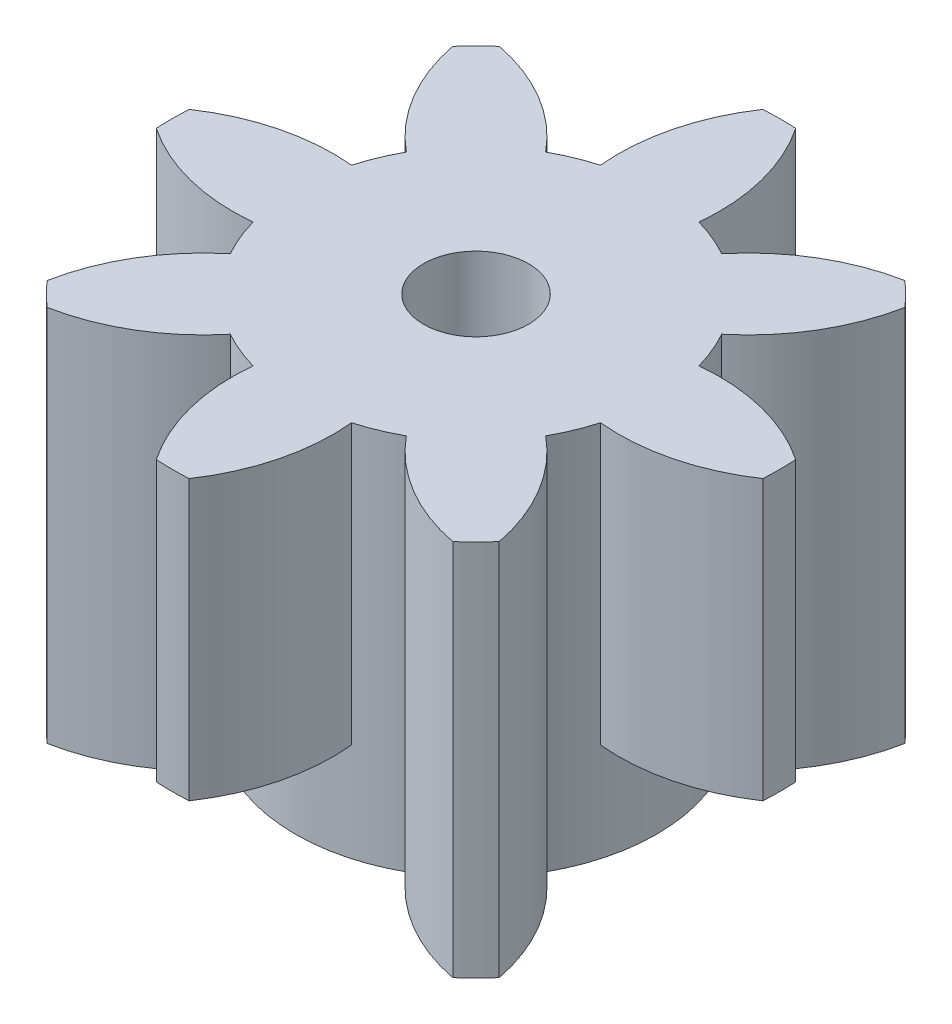
ISO-10303-21;
HEADER;
FILE_DESCRIPTION(('STEP AP214'),'2;1');
FILE_NAME('part.step','',(''),(''),'','','');
FILE_SCHEMA(('AUTOMOTIVE_DESIGN { 1 0 10303 214 1 1 1 1 }'));
ENDSEC;
DATA;
#1=APPLICATION_CONTEXT('core data for automotive mechanical design processes');
#2=APPLICATION_PROTOCOL_DEFINITION('international standard','automotive_design',2000,#1);
#3=PRODUCT_CONTEXT('',#1,'mechanical');
#4=PRODUCT('Part','Part','',(#3));
#5=PRODUCT_RELATED_PRODUCT_CATEGORY('part','',(#4));
#6=PRODUCT_DEFINITION_FORMATION('','',#4);
#7=PRODUCT_DEFINITION_CONTEXT('part definition',#1,'design');
#8=PRODUCT_DEFINITION('design','',#6,#7);
#9=PRODUCT_DEFINITION_SHAPE('','',#8);
#10=(LENGTH_UNIT() NAMED_UNIT(*) SI_UNIT(.MILLI.,.METRE.));
#11=(NAMED_UNIT(*) PLANE_ANGLE_UNIT() SI_UNIT($,.RADIAN.));
#12=(NAMED_UNIT(*) SI_UNIT($,.STERADIAN.) SOLID_ANGLE_UNIT());
#13=UNCERTAINTY_MEASURE_WITH_UNIT(LENGTH_MEASURE(1.E-05),#10,'distance_accuracy_value','');
#14=(GEOMETRIC_REPRESENTATION_CONTEXT(3) GLOBAL_UNCERTAINTY_ASSIGNED_CONTEXT((#13)) GLOBAL_UNIT_ASSIGNED_CONTEXT((#10,
#11,#12)) REPRESENTATION_CONTEXT('',''));
#15=CARTESIAN_POINT('',(0.,0.,0.));
#16=DIRECTION('',(0.,0.,1.));
#17=DIRECTION('',(1.,0.,0.));
#18=AXIS2_PLACEMENT_3D('',#15,#16,#17);
#19=CARTESIAN_POINT('',(-8.94271485970791,-6.,11.754142204529));
#20=DIRECTION('',(0.,1.,0.));
#21=DIRECTION('',(0.,0.,1.));
#22=AXIS2_PLACEMENT_3D('',#19,#20,#21);
#23=CYLINDRICAL_SURFACE('',#22,12.);
#24=DIRECTION('',(0.,1.,0.));
#25=VECTOR('',#24,1.);
#26=CARTESIAN_POINT('',(0.999999999999954,-6.,18.4729532019112));
#27=LINE('',#26,#25);
#28=CARTESIAN_POINT('',(0.999999999999954,0.,18.4729532019112));
#29=VERTEX_POINT('',#28);
#30=CARTESIAN_POINT('',(0.999999999999954,17.,18.4729532019112));
#31=VERTEX_POINT('',#30);
#32=EDGE_CURVE('E49',#29,#31,#27,.T.);
#33=ORIENTED_EDGE('',*,*,#32,.F.);
#34=CARTESIAN_POINT('',(-8.94271485970791,0.,11.754142204529));
#35=DIRECTION('',(0.,1.,0.));
#36=DIRECTION('',(0.,0.,1.));
#37=AXIS2_PLACEMENT_3D('',#34,#35,#36);
#38=CIRCLE('',#37,12.);
#39=CARTESIAN_POINT('',(2.99999999999997,0.,10.5830052442584));
#40=VERTEX_POINT('',#39);
#41=EDGE_CURVE('E445',#29,#40,#38,.T.);
#42=ORIENTED_EDGE('',*,*,#41,.T.);
#43=DIRECTION('',(0.,1.,0.));
#44=VECTOR('',#43,1.);
#45=CARTESIAN_POINT('',(2.99999999999997,-6.,10.5830052442584));
#46=LINE('',#45,#44);
#47=CARTESIAN_POINT('',(2.99999999999997,17.,10.5830052442584));
#48=VERTEX_POINT('',#47);
#49=EDGE_CURVE('E11',#40,#48,#46,.T.);
#50=ORIENTED_EDGE('',*,*,#49,.T.);
#51=CARTESIAN_POINT('',(-8.94271485970791,17.,11.754142204529));
#52=DIRECTION('',(0.,1.,0.));
#53=DIRECTION('',(0.,0.,1.));
#54=AXIS2_PLACEMENT_3D('',#51,#52,#53);
#55=CIRCLE('',#54,12.);
#56=EDGE_CURVE('E526',#31,#48,#55,.T.);
#57=ORIENTED_EDGE('',*,*,#56,.F.);
#58=EDGE_LOOP('',(#33,#42,#50,#57));
#59=FACE_BOUND('',#58,.T.);
#60=ADVANCED_FACE('F41',(#59),#23,.T.);
#61=CARTESIAN_POINT('',(0.,-6.,0.));
#62=DIRECTION('',(0.,1.,0.));
#63=DIRECTION('',(0.,0.,1.));
#64=AXIS2_PLACEMENT_3D('',#61,#62,#63);
#65=CYLINDRICAL_SURFACE('',#64,18.5);
#66=DIRECTION('',(0.,1.,0.));
#67=VECTOR('',#66,1.);
#68=CARTESIAN_POINT('',(-1.00000000000004,-6.,18.4729532019112));
#69=LINE('',#68,#67);
#70=CARTESIAN_POINT('',(-1.00000000000004,0.,18.4729532019112));
#71=VERTEX_POINT('',#70);
#72=CARTESIAN_POINT('',(-1.00000000000004,17.,18.4729532019112));
#73=VERTEX_POINT('',#72);
#74=EDGE_CURVE('E303',#71,#73,#69,.T.);
#75=ORIENTED_EDGE('',*,*,#74,.F.);
#76=CARTESIAN_POINT('',(0.,0.,0.));
#77=DIRECTION('',(0.,1.,0.));
#78=DIRECTION('',(0.,0.,1.));
#79=AXIS2_PLACEMENT_3D('',#76,#77,#78);
#80=CIRCLE('',#79,18.5);
#81=EDGE_CURVE('E444',#71,#29,#80,.T.);
#82=ORIENTED_EDGE('',*,*,#81,.T.);
#83=ORIENTED_EDGE('',*,*,#32,.T.);
#84=CARTESIAN_POINT('',(0.,17.,0.));
#85=DIRECTION('',(0.,1.,0.));
#86=DIRECTION('',(0.,0.,1.));
#87=AXIS2_PLACEMENT_3D('',#84,#85,#86);
#88=CIRCLE('',#87,18.5);
#89=EDGE_CURVE('E424',#73,#31,#88,.T.);
#90=ORIENTED_EDGE('',*,*,#89,.F.);
#91=EDGE_LOOP('',(#75,#82,#83,#90));
#92=FACE_BOUND('',#91,.T.);
#93=ADVANCED_FACE('F573',(#92),#65,.T.);
#94=CARTESIAN_POINT('',(8.94271485970791,-6.,11.754142204529));
#95=DIRECTION('',(0.,1.,0.));
#96=DIRECTION('',(0.,0.,1.));
#97=AXIS2_PLACEMENT_3D('',#94,#95,#96);
#98=CYLINDRICAL_SURFACE('',#97,12.);
#99=CARTESIAN_POINT('',(8.94271485970791,0.,11.754142204529));
#100=DIRECTION('',(0.,1.,0.));
#101=DIRECTION('',(0.,0.,1.));
#102=AXIS2_PLACEMENT_3D('',#99,#100,#101);
#103=CIRCLE('',#102,12.);
#104=CARTESIAN_POINT('',(-3.00000000000004,0.,10.5830052442584));
#105=VERTEX_POINT('',#104);
#106=EDGE_CURVE('E449',#71,#105,#103,.F.);
#107=ORIENTED_EDGE('',*,*,#106,.F.);
#108=ORIENTED_EDGE('',*,*,#74,.T.);
#109=CARTESIAN_POINT('',(8.94271485970791,17.,11.754142204529));
#110=DIRECTION('',(0.,1.,0.));
#111=DIRECTION('',(0.,0.,1.));
#112=AXIS2_PLACEMENT_3D('',#109,#110,#111);
#113=CIRCLE('',#112,12.);
#114=CARTESIAN_POINT('',(-3.00000000000004,17.,10.5830052442584));
#115=VERTEX_POINT('',#114);
#116=EDGE_CURVE('E418',#73,#115,#113,.F.);
#117=ORIENTED_EDGE('',*,*,#116,.T.);
#118=DIRECTION('',(0.,1.,0.));
#119=VECTOR('',#118,1.);
#120=CARTESIAN_POINT('',(-3.00000000000004,-6.,10.5830052442584));
#121=LINE('',#120,#119);
#122=EDGE_CURVE('E304',#105,#115,#121,.T.);
#123=ORIENTED_EDGE('',*,*,#122,.F.);
#124=EDGE_LOOP('',(#107,#108,#117,#123));
#125=FACE_BOUND('',#124,.T.);
#126=ADVANCED_FACE('F577',(#125),#98,.T.);
#127=CARTESIAN_POINT('',(-11.754142204529,-6.,-8.94271485970791));
#128=DIRECTION('',(0.,1.,0.));
#129=DIRECTION('',(0.,0.,1.));
#130=AXIS2_PLACEMENT_3D('',#127,#128,#129);
#131=CYLINDRICAL_SURFACE('',#130,11.9999999999999);
#132=DIRECTION('',(0.,1.,0.));
#133=VECTOR('',#132,1.);
#134=CARTESIAN_POINT('',(-18.4729532019112,-6.,0.999999999999931));
#135=LINE('',#134,#133);
#136=CARTESIAN_POINT('',(-18.4729532019112,0.,0.999999999999931));
#137=VERTEX_POINT('',#136);
#138=CARTESIAN_POINT('',(-18.4729532019112,17.,0.999999999999931));
#139=VERTEX_POINT('',#138);
#140=EDGE_CURVE('E317',#137,#139,#135,.T.);
#141=ORIENTED_EDGE('',*,*,#140,.F.);
#142=CARTESIAN_POINT('',(-11.754142204529,0.,-8.94271485970791));
#143=DIRECTION('',(0.,1.,0.));
#144=DIRECTION('',(0.,0.,1.));
#145=AXIS2_PLACEMENT_3D('',#142,#143,#144);
#146=CIRCLE('',#145,11.9999999999999);
#147=CARTESIAN_POINT('',(-10.5830052442584,0.,2.99999999999995));
#148=VERTEX_POINT('',#147);
#149=EDGE_CURVE('E455',#137,#148,#146,.T.);
#150=ORIENTED_EDGE('',*,*,#149,.T.);
#151=DIRECTION('',(0.,1.,0.));
#152=VECTOR('',#151,1.);
#153=CARTESIAN_POINT('',(-10.5830052442584,-6.,2.99999999999995));
#154=LINE('',#153,#152);
#155=CARTESIAN_POINT('',(-10.5830052442584,17.,2.99999999999995));
#156=VERTEX_POINT('',#155);
#157=EDGE_CURVE('E313',#148,#156,#154,.T.);
#158=ORIENTED_EDGE('',*,*,#157,.T.);
#159=CARTESIAN_POINT('',(-11.754142204529,17.,-8.94271485970791));
#160=DIRECTION('',(0.,1.,0.));
#161=DIRECTION('',(0.,0.,1.));
#162=AXIS2_PLACEMENT_3D('',#159,#160,#161);
#163=CIRCLE('',#162,11.9999999999999);
#164=EDGE_CURVE('E410',#139,#156,#163,.T.);
#165=ORIENTED_EDGE('',*,*,#164,.F.);
#166=EDGE_LOOP('',(#141,#150,#158,#165));
#167=FACE_BOUND('',#166,.T.);
#168=ADVANCED_FACE('F590',(#167),#131,.T.);
#169=CARTESIAN_POINT('',(0.,-6.,0.));
#170=DIRECTION('',(0.,1.,0.));
#171=DIRECTION('',(0.,0.,1.));
#172=AXIS2_PLACEMENT_3D('',#169,#170,#171);
#173=CYLINDRICAL_SURFACE('',#172,18.5);
#174=DIRECTION('',(0.,1.,0.));
#175=VECTOR('',#174,1.);
#176=CARTESIAN_POINT('',(-18.4729532019112,-6.,-1.00000000000007));
#177=LINE('',#176,#175);
#178=CARTESIAN_POINT('',(-18.4729532019112,0.,-1.00000000000007));
#179=VERTEX_POINT('',#178);
#180=CARTESIAN_POINT('',(-18.4729532019112,17.,-1.00000000000007));
#181=VERTEX_POINT('',#180);
#182=EDGE_CURVE('E319',#179,#181,#177,.T.);
#183=ORIENTED_EDGE('',*,*,#182,.F.);
#184=CARTESIAN_POINT('',(0.,0.,0.));
#185=DIRECTION('',(0.,1.,0.));
#186=DIRECTION('',(0.,0.,1.));
#187=AXIS2_PLACEMENT_3D('',#184,#185,#186);
#188=CIRCLE('',#187,18.5);
#189=EDGE_CURVE('E456',#179,#137,#188,.T.);
#190=ORIENTED_EDGE('',*,*,#189,.T.);
#191=ORIENTED_EDGE('',*,*,#140,.T.);
#192=CARTESIAN_POINT('',(0.,17.,0.));
#193=DIRECTION('',(0.,1.,0.));
#194=DIRECTION('',(0.,0.,1.));
#195=AXIS2_PLACEMENT_3D('',#192,#193,#194);
#196=CIRCLE('',#195,18.5);
#197=EDGE_CURVE('E404',#181,#139,#196,.T.);
#198=ORIENTED_EDGE('',*,*,#197,.F.);
#199=EDGE_LOOP('',(#183,#190,#191,#198));
#200=FACE_BOUND('',#199,.T.);
#201=ADVANCED_FACE('F595',(#200),#173,.T.);
#202=CARTESIAN_POINT('',(-11.754142204529,-6.,8.94271485970791));
#203=DIRECTION('',(0.,1.,0.));
#204=DIRECTION('',(0.,0.,1.));
#205=AXIS2_PLACEMENT_3D('',#202,#203,#204);
#206=CYLINDRICAL_SURFACE('',#205,12.0000000000001);
#207=CARTESIAN_POINT('',(-11.754142204529,0.,8.94271485970791));
#208=DIRECTION('',(0.,1.,0.));
#209=DIRECTION('',(0.,0.,1.));
#210=AXIS2_PLACEMENT_3D('',#207,#208,#209);
#211=CIRCLE('',#210,12.0000000000001);
#212=CARTESIAN_POINT('',(-10.5830052442583,0.,-3.00000000000006));
#213=VERTEX_POINT('',#212);
#214=EDGE_CURVE('E441',#179,#213,#211,.F.);
#215=ORIENTED_EDGE('',*,*,#214,.F.);
#216=ORIENTED_EDGE('',*,*,#182,.T.);
#217=CARTESIAN_POINT('',(-11.754142204529,17.,8.94271485970791));
#218=DIRECTION('',(0.,1.,0.));
#219=DIRECTION('',(0.,0.,1.));
#220=AXIS2_PLACEMENT_3D('',#217,#218,#219);
#221=CIRCLE('',#220,12.0000000000001);
#222=CARTESIAN_POINT('',(-10.5830052442583,17.,-3.00000000000006));
#223=VERTEX_POINT('',#222);
#224=EDGE_CURVE('E400',#181,#223,#221,.F.);
#225=ORIENTED_EDGE('',*,*,#224,.T.);
#226=DIRECTION('',(0.,1.,0.));
#227=VECTOR('',#226,1.);
#228=CARTESIAN_POINT('',(-10.5830052442583,-6.,-3.00000000000006));
#229=LINE('',#228,#227);
#230=EDGE_CURVE('E318',#213,#223,#229,.T.);
#231=ORIENTED_EDGE('',*,*,#230,.F.);
#232=EDGE_LOOP('',(#215,#216,#225,#231));
#233=FACE_BOUND('',#232,.T.);
#234=ADVANCED_FACE('F596',(#233),#206,.T.);
#235=CARTESIAN_POINT('',(8.94271485970791,-6.,-11.754142204529));
#236=DIRECTION('',(0.,1.,0.));
#237=DIRECTION('',(0.,0.,1.));
#238=AXIS2_PLACEMENT_3D('',#235,#236,#237);
#239=CYLINDRICAL_SURFACE('',#238,12.);
#240=DIRECTION('',(0.,1.,0.));
#241=VECTOR('',#240,1.);
#242=CARTESIAN_POINT('',(-0.999999999999997,-6.,-18.4729532019112));
#243=LINE('',#242,#241);
#244=CARTESIAN_POINT('',(-0.999999999999997,0.,-18.4729532019112));
#245=VERTEX_POINT('',#244);
#246=CARTESIAN_POINT('',(-0.999999999999997,17.,-18.4729532019112));
#247=VERTEX_POINT('',#246);
#248=EDGE_CURVE('E335',#245,#247,#243,.T.);
#249=ORIENTED_EDGE('',*,*,#248,.F.);
#250=CARTESIAN_POINT('',(8.94271485970791,0.,-11.754142204529));
#251=DIRECTION('',(0.,1.,0.));
#252=DIRECTION('',(0.,0.,1.));
#253=AXIS2_PLACEMENT_3D('',#250,#251,#252);
#254=CIRCLE('',#253,12.);
#255=CARTESIAN_POINT('',(-3.,0.,-10.5830052442584));
#256=VERTEX_POINT('',#255);
#257=EDGE_CURVE('E464',#245,#256,#254,.T.);
#258=ORIENTED_EDGE('',*,*,#257,.T.);
#259=DIRECTION('',(0.,1.,0.));
#260=VECTOR('',#259,1.);
#261=CARTESIAN_POINT('',(-3.,-6.,-10.5830052442584));
#262=LINE('',#261,#260);
#263=CARTESIAN_POINT('',(-3.,17.,-10.5830052442584));
#264=VERTEX_POINT('',#263);
#265=EDGE_CURVE('E327',#256,#264,#262,.T.);
#266=ORIENTED_EDGE('',*,*,#265,.T.);
#267=CARTESIAN_POINT('',(8.94271485970791,17.,-11.754142204529));
#268=DIRECTION('',(0.,1.,0.));
#269=DIRECTION('',(0.,0.,1.));
#270=AXIS2_PLACEMENT_3D('',#267,#268,#269);
#271=CIRCLE('',#270,12.);
#272=EDGE_CURVE('E389',#247,#264,#271,.T.);
#273=ORIENTED_EDGE('',*,*,#272,.F.);
#274=EDGE_LOOP('',(#249,#258,#266,#273));
#275=FACE_BOUND('',#274,.T.);
#276=ADVANCED_FACE('F477',(#275),#239,.T.);
#277=CARTESIAN_POINT('',(0.,-6.,0.));
#278=DIRECTION('',(0.,1.,0.));
#279=DIRECTION('',(0.,0.,1.));
#280=AXIS2_PLACEMENT_3D('',#277,#278,#279);
#281=CYLINDRICAL_SURFACE('',#280,18.5);
#282=DIRECTION('',(0.,1.,0.));
#283=VECTOR('',#282,1.);
#284=CARTESIAN_POINT('',(0.999999999999997,-6.,-18.4729532019112));
#285=LINE('',#284,#283);
#286=CARTESIAN_POINT('',(0.999999999999997,0.,-18.4729532019112));
#287=VERTEX_POINT('',#286);
#288=CARTESIAN_POINT('',(0.999999999999997,17.,-18.4729532019112));
#289=VERTEX_POINT('',#288);
#290=EDGE_CURVE('E333',#287,#289,#285,.T.);
#291=ORIENTED_EDGE('',*,*,#290,.F.);
#292=CARTESIAN_POINT('',(0.,0.,0.));
#293=DIRECTION('',(0.,1.,0.));
#294=DIRECTION('',(0.,0.,1.));
#295=AXIS2_PLACEMENT_3D('',#292,#293,#294);
#296=CIRCLE('',#295,18.5);
#297=EDGE_CURVE('E452',#287,#245,#296,.T.);
#298=ORIENTED_EDGE('',*,*,#297,.T.);
#299=ORIENTED_EDGE('',*,*,#248,.T.);
#300=CARTESIAN_POINT('',(0.,17.,0.));
#301=DIRECTION('',(0.,1.,0.));
#302=DIRECTION('',(0.,0.,1.));
#303=AXIS2_PLACEMENT_3D('',#300,#301,#302);
#304=CIRCLE('',#303,18.5);
#305=EDGE_CURVE('E385',#289,#247,#304,.T.);
#306=ORIENTED_EDGE('',*,*,#305,.F.);
#307=EDGE_LOOP('',(#291,#298,#299,#306));
#308=FACE_BOUND('',#307,.T.);
#309=ADVANCED_FACE('F472',(#308),#281,.T.);
#310=CARTESIAN_POINT('',(-8.94271485970791,-6.,-11.754142204529));
#311=DIRECTION('',(0.,1.,0.));
#312=DIRECTION('',(0.,0.,1.));
#313=AXIS2_PLACEMENT_3D('',#310,#311,#312);
#314=CYLINDRICAL_SURFACE('',#313,12.);
#315=CARTESIAN_POINT('',(-8.94271485970791,0.,-11.754142204529));
#316=DIRECTION('',(0.,1.,0.));
#317=DIRECTION('',(0.,0.,1.));
#318=AXIS2_PLACEMENT_3D('',#315,#316,#317);
#319=CIRCLE('',#318,12.);
#320=CARTESIAN_POINT('',(3.,0.,-10.5830052442584));
#321=VERTEX_POINT('',#320);
#322=EDGE_CURVE('E268',#287,#321,#319,.F.);
#323=ORIENTED_EDGE('',*,*,#322,.F.);
#324=ORIENTED_EDGE('',*,*,#290,.T.);
#325=CARTESIAN_POINT('',(-8.94271485970791,17.,-11.754142204529));
#326=DIRECTION('',(0.,1.,0.));
#327=DIRECTION('',(0.,0.,1.));
#328=AXIS2_PLACEMENT_3D('',#325,#326,#327);
#329=CIRCLE('',#328,12.);
#330=CARTESIAN_POINT('',(3.,17.,-10.5830052442584));
#331=VERTEX_POINT('',#330);
#332=EDGE_CURVE('E374',#289,#331,#329,.F.);
#333=ORIENTED_EDGE('',*,*,#332,.T.);
#334=DIRECTION('',(0.,1.,0.));
#335=VECTOR('',#334,1.);
#336=CARTESIAN_POINT('',(3.,-6.,-10.5830052442584));
#337=LINE('',#336,#335);
#338=EDGE_CURVE('E337',#321,#331,#337,.T.);
#339=ORIENTED_EDGE('',*,*,#338,.F.);
#340=EDGE_LOOP('',(#323,#324,#333,#339));
#341=FACE_BOUND('',#340,.T.);
#342=ADVANCED_FACE('F656',(#341),#314,.T.);
#343=CARTESIAN_POINT('',(11.754142204529,-6.,8.94271485970791));
#344=DIRECTION('',(0.,1.,0.));
#345=DIRECTION('',(0.,0.,1.));
#346=AXIS2_PLACEMENT_3D('',#343,#344,#345);
#347=CYLINDRICAL_SURFACE('',#346,12.);
#348=DIRECTION('',(0.,1.,0.));
#349=VECTOR('',#348,1.);
#350=CARTESIAN_POINT('',(18.4729532019112,-6.,-0.999999999999977));
#351=LINE('',#350,#349);
#352=CARTESIAN_POINT('',(18.4729532019112,0.,-0.999999999999977));
#353=VERTEX_POINT('',#352);
#354=CARTESIAN_POINT('',(18.4729532019112,17.,-0.999999999999977));
#355=VERTEX_POINT('',#354);
#356=EDGE_CURVE('E273',#353,#355,#351,.T.);
#357=ORIENTED_EDGE('',*,*,#356,.F.);
#358=CARTESIAN_POINT('',(11.754142204529,0.,8.94271485970791));
#359=DIRECTION('',(0.,1.,0.));
#360=DIRECTION('',(0.,0.,1.));
#361=AXIS2_PLACEMENT_3D('',#358,#359,#360);
#362=CIRCLE('',#361,12.);
#363=CARTESIAN_POINT('',(10.5830052442584,0.,-2.99999999999998));
#364=VERTEX_POINT('',#363);
#365=EDGE_CURVE('E257',#353,#364,#362,.T.);
#366=ORIENTED_EDGE('',*,*,#365,.T.);
#367=DIRECTION('',(0.,1.,0.));
#368=VECTOR('',#367,1.);
#369=CARTESIAN_POINT('',(10.5830052442584,-6.,-2.99999999999998));
#370=LINE('',#369,#368);
#371=CARTESIAN_POINT('',(10.5830052442584,17.,-2.99999999999998));
#372=VERTEX_POINT('',#371);
#373=EDGE_CURVE('E279',#364,#372,#370,.T.);
#374=ORIENTED_EDGE('',*,*,#373,.T.);
#375=CARTESIAN_POINT('',(11.754142204529,17.,8.94271485970791));
#376=DIRECTION('',(0.,1.,0.));
#377=DIRECTION('',(0.,0.,1.));
#378=AXIS2_PLACEMENT_3D('',#375,#376,#377);
#379=CIRCLE('',#378,12.);
#380=EDGE_CURVE('E347',#355,#372,#379,.T.);
#381=ORIENTED_EDGE('',*,*,#380,.F.);
#382=EDGE_LOOP('',(#357,#366,#374,#381));
#383=FACE_BOUND('',#382,.T.);
#384=ADVANCED_FACE('F348',(#383),#347,.T.);
#385=CARTESIAN_POINT('',(0.,-6.,0.));
#386=DIRECTION('',(0.,1.,0.));
#387=DIRECTION('',(0.,0.,1.));
#388=AXIS2_PLACEMENT_3D('',#385,#386,#387);
#389=CYLINDRICAL_SURFACE('',#388,18.5);
#390=DIRECTION('',(0.,1.,0.));
#391=VECTOR('',#390,1.);
#392=CARTESIAN_POINT('',(18.4729532019112,-6.,1.00000000000003));
#393=LINE('',#392,#391);
#394=CARTESIAN_POINT('',(18.4729532019112,0.,1.00000000000003));
#395=VERTEX_POINT('',#394);
#396=CARTESIAN_POINT('',(18.4729532019112,17.,1.00000000000003));
#397=VERTEX_POINT('',#396);
#398=EDGE_CURVE('E266',#395,#397,#393,.T.);
#399=ORIENTED_EDGE('',*,*,#398,.F.);
#400=CARTESIAN_POINT('',(0.,0.,0.));
#401=DIRECTION('',(0.,1.,0.));
#402=DIRECTION('',(0.,0.,1.));
#403=AXIS2_PLACEMENT_3D('',#400,#401,#402);
#404=CIRCLE('',#403,18.5);
#405=EDGE_CURVE('E255',#395,#353,#404,.T.);
#406=ORIENTED_EDGE('',*,*,#405,.T.);
#407=ORIENTED_EDGE('',*,*,#356,.T.);
#408=CARTESIAN_POINT('',(0.,17.,0.));
#409=DIRECTION('',(0.,1.,0.));
#410=DIRECTION('',(0.,0.,1.));
#411=AXIS2_PLACEMENT_3D('',#408,#409,#410);
#412=CIRCLE('',#411,18.5);
#413=EDGE_CURVE('E271',#397,#355,#412,.T.);
#414=ORIENTED_EDGE('',*,*,#413,.F.);
#415=EDGE_LOOP('',(#399,#406,#407,#414));
#416=FACE_BOUND('',#415,.T.);
#417=ADVANCED_FACE('F272',(#416),#389,.T.);
#418=CARTESIAN_POINT('',(11.754142204529,-6.,-8.94271485970791));
#419=DIRECTION('',(0.,1.,0.));
#420=DIRECTION('',(0.,0.,1.));
#421=AXIS2_PLACEMENT_3D('',#418,#419,#420);
#422=CYLINDRICAL_SURFACE('',#421,12.);
#423=CARTESIAN_POINT('',(11.754142204529,0.,-8.94271485970791));
#424=DIRECTION('',(0.,1.,0.));
#425=DIRECTION('',(0.,0.,1.));
#426=AXIS2_PLACEMENT_3D('',#423,#424,#425);
#427=CIRCLE('',#426,12.);
#428=CARTESIAN_POINT('',(10.5830052442584,0.,3.00000000000002));
#429=VERTEX_POINT('',#428);
#430=EDGE_CURVE('E253',#395,#429,#427,.F.);
#431=ORIENTED_EDGE('',*,*,#430,.F.);
#432=ORIENTED_EDGE('',*,*,#398,.T.);
#433=CARTESIAN_POINT('',(11.754142204529,17.,-8.94271485970791));
#434=DIRECTION('',(0.,1.,0.));
#435=DIRECTION('',(0.,0.,1.));
#436=AXIS2_PLACEMENT_3D('',#433,#434,#435);
#437=CIRCLE('',#436,12.);
#438=CARTESIAN_POINT('',(10.5830052442584,17.,3.00000000000002));
#439=VERTEX_POINT('',#438);
#440=EDGE_CURVE('E375',#397,#439,#437,.F.);
#441=ORIENTED_EDGE('',*,*,#440,.T.);
#442=DIRECTION('',(0.,1.,0.));
#443=VECTOR('',#442,1.);
#444=CARTESIAN_POINT('',(10.5830052442584,-6.,3.00000000000002));
#445=LINE('',#444,#443);
#446=EDGE_CURVE('E267',#429,#439,#445,.T.);
#447=ORIENTED_EDGE('',*,*,#446,.F.);
#448=EDGE_LOOP('',(#431,#432,#441,#447));
#449=FACE_BOUND('',#448,.T.);
#450=ADVANCED_FACE('F263',(#449),#422,.T.);
#451=CARTESIAN_POINT('',(0.,-6.,0.));
#452=DIRECTION('',(0.,1.,0.));
#453=DIRECTION('',(0.,0.,1.));
#454=AXIS2_PLACEMENT_3D('',#451,#452,#453);
#455=PLANE('',#454);
#456=CARTESIAN_POINT('',(0.,-6.,0.));
#457=DIRECTION('',(0.,1.,0.));
#458=DIRECTION('',(0.,0.,1.));
#459=AXIS2_PLACEMENT_3D('',#456,#457,#458);
#460=CIRCLE('',#459,3.2);
#461=CARTESIAN_POINT('',(0.,-6.,3.2));
#462=VERTEX_POINT('',#461);
#463=EDGE_CURVE('E525',#462,#462,#460,.T.);
#464=ORIENTED_EDGE('',*,*,#463,.T.);
#465=EDGE_LOOP('',(#464));
#466=FACE_BOUND('',#465,.T.);
#467=CARTESIAN_POINT('',(1.98797934033628,-6.,-14.6348879793706));
#468=DIRECTION('',(0.,1.,0.));
#469=DIRECTION('',(0.,0.,1.));
#470=AXIS2_PLACEMENT_3D('',#467,#468,#469);
#471=CIRCLE('',#470,12.);
#472=CARTESIAN_POINT('',(13.7694572587997,-6.,-12.3552436964266));
#473=VERTEX_POINT('',#472);
#474=CARTESIAN_POINT('',(9.60463511710753,-6.,-5.36199442998823));
#475=VERTEX_POINT('',#474);
#476=EDGE_CURVE('E530',#473,#475,#471,.F.);
#477=ORIENTED_EDGE('',*,*,#476,.T.);
#478=CARTESIAN_POINT('',(0.,-6.,0.));
#479=DIRECTION('',(0.,1.,0.));
#480=DIRECTION('',(0.,0.,1.));
#481=AXIS2_PLACEMENT_3D('',#478,#479,#480);
#482=CIRCLE('',#481,11.);
#483=CARTESIAN_POINT('',(9.60463511710751,-6.,5.36199442998826));
#484=VERTEX_POINT('',#483);
#485=EDGE_CURVE('E524',#484,#475,#482,.T.);
#486=ORIENTED_EDGE('',*,*,#485,.F.);
#487=CARTESIAN_POINT('',(1.98797934033628,-6.,14.6348879793706));
#488=DIRECTION('',(0.,1.,0.));
#489=DIRECTION('',(0.,0.,1.));
#490=AXIS2_PLACEMENT_3D('',#487,#488,#489);
#491=CIRCLE('',#490,12.);
#492=CARTESIAN_POINT('',(13.7694572587997,-6.,12.3552436964266));
#493=VERTEX_POINT('',#492);
#494=EDGE_CURVE('E527',#493,#484,#491,.T.);
#495=ORIENTED_EDGE('',*,*,#494,.F.);
#496=CARTESIAN_POINT('',(0.,-6.,0.));
#497=DIRECTION('',(0.,1.,0.));
#498=DIRECTION('',(0.,0.,1.));
#499=AXIS2_PLACEMENT_3D('',#496,#497,#498);
#500=CIRCLE('',#499,18.5);
#501=CARTESIAN_POINT('',(12.3552436964266,-6.,13.7694572587997));
#502=VERTEX_POINT('',#501);
#503=EDGE_CURVE('E523',#502,#493,#500,.T.);
#504=ORIENTED_EDGE('',*,*,#503,.F.);
#505=CARTESIAN_POINT('',(14.6348879793706,-6.,1.98797934033628));
#506=DIRECTION('',(0.,1.,0.));
#507=DIRECTION('',(0.,0.,1.));
#508=AXIS2_PLACEMENT_3D('',#505,#506,#507);
#509=CIRCLE('',#508,12.);
#510=CARTESIAN_POINT('',(5.36199442998822,-6.,9.60463511710754));
#511=VERTEX_POINT('',#510);
#512=EDGE_CURVE('E521',#502,#511,#509,.F.);
#513=ORIENTED_EDGE('',*,*,#512,.T.);
#514=CARTESIAN_POINT('',(-5.36199442998828,-6.,9.6046351171075));
#515=VERTEX_POINT('',#514);
#516=EDGE_CURVE('E59',#515,#511,#482,.T.);
#517=ORIENTED_EDGE('',*,*,#516,.F.);
#518=CARTESIAN_POINT('',(-14.6348879793706,-6.,1.98797934033628));
#519=DIRECTION('',(0.,1.,0.));
#520=DIRECTION('',(0.,0.,1.));
#521=AXIS2_PLACEMENT_3D('',#518,#519,#520);
#522=CIRCLE('',#521,12.);
#523=CARTESIAN_POINT('',(-12.3552436964266,-6.,13.7694572587996));
#524=VERTEX_POINT('',#523);
#525=EDGE_CURVE('E289',#524,#515,#522,.T.);
#526=ORIENTED_EDGE('',*,*,#525,.F.);
#527=CARTESIAN_POINT('',(0.,-6.,0.));
#528=DIRECTION('',(0.,1.,0.));
#529=DIRECTION('',(0.,0.,1.));
#530=AXIS2_PLACEMENT_3D('',#527,#528,#529);
#531=CIRCLE('',#530,18.5);
#532=CARTESIAN_POINT('',(-13.7694572587997,-6.,12.3552436964265));
#533=VERTEX_POINT('',#532);
#534=EDGE_CURVE('E294',#533,#524,#531,.T.);
#535=ORIENTED_EDGE('',*,*,#534,.F.);
#536=CARTESIAN_POINT('',(-1.98797934033628,-6.,14.6348879793706));
#537=DIRECTION('',(0.,1.,0.));
#538=DIRECTION('',(0.,0.,1.));
#539=AXIS2_PLACEMENT_3D('',#536,#537,#538);
#540=CIRCLE('',#539,12.);
#541=CARTESIAN_POINT('',(-9.60463511710755,-6.,5.3619944299882));
#542=VERTEX_POINT('',#541);
#543=EDGE_CURVE('E296',#533,#542,#540,.F.);
#544=ORIENTED_EDGE('',*,*,#543,.T.);
#545=CARTESIAN_POINT('',(-9.6046351171075,-6.,-5.36199442998829));
#546=VERTEX_POINT('',#545);
#547=EDGE_CURVE('E510',#546,#542,#482,.T.);
#548=ORIENTED_EDGE('',*,*,#547,.F.);
#549=CARTESIAN_POINT('',(-1.98797934033628,-6.,-14.6348879793706));
#550=DIRECTION('',(0.,1.,0.));
#551=DIRECTION('',(0.,0.,1.));
#552=AXIS2_PLACEMENT_3D('',#549,#550,#551);
#553=CIRCLE('',#552,11.9999999999999);
#554=CARTESIAN_POINT('',(-13.7694572587996,-6.,-12.3552436964266));
#555=VERTEX_POINT('',#554);
#556=EDGE_CURVE('E503',#555,#546,#553,.T.);
#557=ORIENTED_EDGE('',*,*,#556,.F.);
#558=CARTESIAN_POINT('',(0.,-6.,0.));
#559=DIRECTION('',(0.,1.,0.));
#560=DIRECTION('',(0.,0.,1.));
#561=AXIS2_PLACEMENT_3D('',#558,#559,#560);
#562=CIRCLE('',#561,18.5);
#563=CARTESIAN_POINT('',(-12.3552436964265,-6.,-13.7694572587997));
#564=VERTEX_POINT('',#563);
#565=EDGE_CURVE('E518',#564,#555,#562,.T.);
#566=ORIENTED_EDGE('',*,*,#565,.F.);
#567=CARTESIAN_POINT('',(-14.6348879793706,-6.,-1.98797934033628));
#568=DIRECTION('',(0.,1.,0.));
#569=DIRECTION('',(0.,0.,1.));
#570=AXIS2_PLACEMENT_3D('',#567,#568,#569);
#571=CIRCLE('',#570,12.0000000000001);
#572=CARTESIAN_POINT('',(-5.36199442998818,-6.,-9.60463511710756));
#573=VERTEX_POINT('',#572);
#574=EDGE_CURVE('E495',#564,#573,#571,.F.);
#575=ORIENTED_EDGE('',*,*,#574,.T.);
#576=CARTESIAN_POINT('',(5.36199442998825,-6.,-9.60463511710752));
#577=VERTEX_POINT('',#576);
#578=EDGE_CURVE('E487',#577,#573,#482,.T.);
#579=ORIENTED_EDGE('',*,*,#578,.F.);
#580=CARTESIAN_POINT('',(14.6348879793706,-6.,-1.98797934033628));
#581=DIRECTION('',(0.,1.,0.));
#582=DIRECTION('',(0.,0.,1.));
#583=AXIS2_PLACEMENT_3D('',#580,#581,#582);
#584=CIRCLE('',#583,12.);
#585=CARTESIAN_POINT('',(12.3552436964266,-6.,-13.7694572587997));
#586=VERTEX_POINT('',#585);
#587=EDGE_CURVE('E516',#586,#577,#584,.T.);
#588=ORIENTED_EDGE('',*,*,#587,.F.);
#589=CARTESIAN_POINT('',(0.,-6.,0.));
#590=DIRECTION('',(0.,1.,0.));
#591=DIRECTION('',(0.,0.,1.));
#592=AXIS2_PLACEMENT_3D('',#589,#590,#591);
#593=CIRCLE('',#592,18.5);
#594=EDGE_CURVE('E529',#473,#586,#593,.T.);
#595=ORIENTED_EDGE('',*,*,#594,.F.);
#596=EDGE_LOOP('',(#477,#486,#495,#504,#513,#517,#526,#535,#544,#548,#557,#566,#575,#579,#588,#595));
#597=FACE_BOUND('',#596,.T.);
#598=ADVANCED_FACE('F509',(#466,#597),#455,.F.);
#599=CARTESIAN_POINT('',(0.,-6.,0.));
#600=DIRECTION('',(0.,1.,0.));
#601=DIRECTION('',(0.,0.,1.));
#602=AXIS2_PLACEMENT_3D('',#599,#600,#601);
#603=CYLINDRICAL_SURFACE('',#602,11.);
#604=DIRECTION('',(0.,1.,0.));
#605=VECTOR('',#604,1.);
#606=CARTESIAN_POINT('',(-5.36199442998828,-6.,9.6046351171075));
#607=LINE('',#606,#605);
#608=CARTESIAN_POINT('',(-5.36199442998828,17.,9.6046351171075));
#609=VERTEX_POINT('',#608);
#610=EDGE_CURVE('E310',#515,#609,#607,.T.);
#611=ORIENTED_EDGE('',*,*,#610,.F.);
#612=ORIENTED_EDGE('',*,*,#516,.T.);
#613=DIRECTION('',(0.,1.,0.));
#614=VECTOR('',#613,1.);
#615=CARTESIAN_POINT('',(5.36199442998822,-6.,9.60463511710754));
#616=LINE('',#615,#614);
#617=CARTESIAN_POINT('',(5.36199442998822,17.,9.60463511710754));
#618=VERTEX_POINT('',#617);
#619=EDGE_CURVE('E44',#511,#618,#616,.T.);
#620=ORIENTED_EDGE('',*,*,#619,.T.);
#621=CARTESIAN_POINT('',(0.,17.,0.));
#622=DIRECTION('',(0.,1.,0.));
#623=DIRECTION('',(0.,0.,1.));
#624=AXIS2_PLACEMENT_3D('',#621,#622,#623);
#625=CIRCLE('',#624,11.);
#626=EDGE_CURVE('E368',#48,#618,#625,.T.);
#627=ORIENTED_EDGE('',*,*,#626,.F.);
#628=ORIENTED_EDGE('',*,*,#49,.F.);
#629=CARTESIAN_POINT('',(0.,0.,0.));
#630=DIRECTION('',(0.,1.,0.));
#631=DIRECTION('',(0.,0.,1.));
#632=AXIS2_PLACEMENT_3D('',#629,#630,#631);
#633=CIRCLE('',#632,11.);
#634=EDGE_CURVE('E437',#105,#40,#633,.T.);
#635=ORIENTED_EDGE('',*,*,#634,.F.);
#636=ORIENTED_EDGE('',*,*,#122,.T.);
#637=EDGE_CURVE('E406',#609,#115,#625,.T.);
#638=ORIENTED_EDGE('',*,*,#637,.F.);
#639=EDGE_LOOP('',(#611,#612,#620,#627,#628,#635,#636,#638));
#640=FACE_BOUND('',#639,.T.);
#641=ADVANCED_FACE('F568',(#640),#603,.T.);
#642=CARTESIAN_POINT('',(-14.6348879793706,-6.,1.98797934033628));
#643=DIRECTION('',(0.,1.,0.));
#644=DIRECTION('',(0.,0.,1.));
#645=AXIS2_PLACEMENT_3D('',#642,#643,#644);
#646=CYLINDRICAL_SURFACE('',#645,12.);
#647=ORIENTED_EDGE('',*,*,#610,.T.);
#648=CARTESIAN_POINT('',(-14.6348879793706,17.,1.98797934033628));
#649=DIRECTION('',(0.,1.,0.));
#650=DIRECTION('',(0.,0.,1.));
#651=AXIS2_PLACEMENT_3D('',#648,#649,#650);
#652=CIRCLE('',#651,12.);
#653=CARTESIAN_POINT('',(-12.3552436964266,17.,13.7694572587996));
#654=VERTEX_POINT('',#653);
#655=EDGE_CURVE('E419',#654,#609,#652,.T.);
#656=ORIENTED_EDGE('',*,*,#655,.F.);
#657=DIRECTION('',(0.,1.,0.));
#658=VECTOR('',#657,1.);
#659=CARTESIAN_POINT('',(-12.3552436964266,-6.,13.7694572587996));
#660=LINE('',#659,#658);
#661=EDGE_CURVE('E69',#524,#654,#660,.T.);
#662=ORIENTED_EDGE('',*,*,#661,.F.);
#663=ORIENTED_EDGE('',*,*,#525,.T.);
#664=EDGE_LOOP('',(#647,#656,#662,#663));
#665=FACE_BOUND('',#664,.T.);
#666=ADVANCED_FACE('F579',(#665),#646,.T.);
#667=CARTESIAN_POINT('',(0.,-6.,0.));
#668=DIRECTION('',(0.,1.,0.));
#669=DIRECTION('',(0.,0.,1.));
#670=AXIS2_PLACEMENT_3D('',#667,#668,#669);
#671=CYLINDRICAL_SURFACE('',#670,18.5);
#672=ORIENTED_EDGE('',*,*,#661,.T.);
#673=CARTESIAN_POINT('',(0.,17.,0.));
#674=DIRECTION('',(0.,1.,0.));
#675=DIRECTION('',(0.,0.,1.));
#676=AXIS2_PLACEMENT_3D('',#673,#674,#675);
#677=CIRCLE('',#676,18.5);
#678=CARTESIAN_POINT('',(-13.7694572587997,17.,12.3552436964265));
#679=VERTEX_POINT('',#678);
#680=EDGE_CURVE('E412',#679,#654,#677,.T.);
#681=ORIENTED_EDGE('',*,*,#680,.F.);
#682=DIRECTION('',(0.,1.,0.));
#683=VECTOR('',#682,1.);
#684=CARTESIAN_POINT('',(-13.7694572587997,-6.,12.3552436964265));
#685=LINE('',#684,#683);
#686=EDGE_CURVE('E309',#533,#679,#685,.T.);
#687=ORIENTED_EDGE('',*,*,#686,.F.);
#688=ORIENTED_EDGE('',*,*,#534,.T.);
#689=EDGE_LOOP('',(#672,#681,#687,#688));
#690=FACE_BOUND('',#689,.T.);
#691=ADVANCED_FACE('F583',(#690),#671,.T.);
#692=CARTESIAN_POINT('',(-1.98797934033628,-6.,14.6348879793706));
#693=DIRECTION('',(0.,1.,0.));
#694=DIRECTION('',(0.,0.,1.));
#695=AXIS2_PLACEMENT_3D('',#692,#693,#694);
#696=CYLINDRICAL_SURFACE('',#695,12.);
#697=ORIENTED_EDGE('',*,*,#686,.T.);
#698=CARTESIAN_POINT('',(-1.98797934033628,17.,14.6348879793706));
#699=DIRECTION('',(0.,1.,0.));
#700=DIRECTION('',(0.,0.,1.));
#701=AXIS2_PLACEMENT_3D('',#698,#699,#700);
#702=CIRCLE('',#701,12.);
#703=CARTESIAN_POINT('',(-9.60463511710755,17.,5.3619944299882));
#704=VERTEX_POINT('',#703);
#705=EDGE_CURVE('E407',#679,#704,#702,.F.);
#706=ORIENTED_EDGE('',*,*,#705,.T.);
#707=DIRECTION('',(0.,1.,0.));
#708=VECTOR('',#707,1.);
#709=CARTESIAN_POINT('',(-9.60463511710755,-6.,5.3619944299882));
#710=LINE('',#709,#708);
#711=EDGE_CURVE('E315',#542,#704,#710,.T.);
#712=ORIENTED_EDGE('',*,*,#711,.F.);
#713=ORIENTED_EDGE('',*,*,#543,.F.);
#714=EDGE_LOOP('',(#697,#706,#712,#713));
#715=FACE_BOUND('',#714,.T.);
#716=ADVANCED_FACE('F582',(#715),#696,.T.);
#717=ORIENTED_EDGE('',*,*,#711,.T.);
#718=EDGE_CURVE('E398',#156,#704,#625,.T.);
#719=ORIENTED_EDGE('',*,*,#718,.F.);
#720=ORIENTED_EDGE('',*,*,#157,.F.);
#721=CARTESIAN_POINT('',(0.,0.,0.));
#722=DIRECTION('',(0.,1.,0.));
#723=DIRECTION('',(0.,0.,1.));
#724=AXIS2_PLACEMENT_3D('',#721,#722,#723);
#725=CIRCLE('',#724,11.);
#726=EDGE_CURVE('E453',#213,#148,#725,.T.);
#727=ORIENTED_EDGE('',*,*,#726,.F.);
#728=ORIENTED_EDGE('',*,*,#230,.T.);
#729=CARTESIAN_POINT('',(-9.6046351171075,17.,-5.36199442998829));
#730=VERTEX_POINT('',#729);
#731=EDGE_CURVE('E387',#730,#223,#625,.T.);
#732=ORIENTED_EDGE('',*,*,#731,.F.);
#733=DIRECTION('',(0.,1.,0.));
#734=VECTOR('',#733,1.);
#735=CARTESIAN_POINT('',(-9.6046351171075,-6.,-5.36199442998829));
#736=LINE('',#735,#734);
#737=EDGE_CURVE('E324',#546,#730,#736,.T.);
#738=ORIENTED_EDGE('',*,*,#737,.F.);
#739=ORIENTED_EDGE('',*,*,#547,.T.);
#740=EDGE_LOOP('',(#717,#719,#720,#727,#728,#732,#738,#739));
#741=FACE_BOUND('',#740,.T.);
#742=ADVANCED_FACE('F506',(#741),#603,.T.);
#743=CARTESIAN_POINT('',(-1.98797934033628,-6.,-14.6348879793706));
#744=DIRECTION('',(0.,1.,0.));
#745=DIRECTION('',(0.,0.,1.));
#746=AXIS2_PLACEMENT_3D('',#743,#744,#745);
#747=CYLINDRICAL_SURFACE('',#746,11.9999999999999);
#748=ORIENTED_EDGE('',*,*,#737,.T.);
#749=CARTESIAN_POINT('',(-1.98797934033628,17.,-14.6348879793706));
#750=DIRECTION('',(0.,1.,0.));
#751=DIRECTION('',(0.,0.,1.));
#752=AXIS2_PLACEMENT_3D('',#749,#750,#751);
#753=CIRCLE('',#752,11.9999999999999);
#754=CARTESIAN_POINT('',(-13.7694572587996,17.,-12.3552436964266));
#755=VERTEX_POINT('',#754);
#756=EDGE_CURVE('E397',#755,#730,#753,.T.);
#757=ORIENTED_EDGE('',*,*,#756,.F.);
#758=DIRECTION('',(0.,1.,0.));
#759=VECTOR('',#758,1.);
#760=CARTESIAN_POINT('',(-13.7694572587996,-6.,-12.3552436964266));
#761=LINE('',#760,#759);
#762=EDGE_CURVE('E325',#555,#755,#761,.T.);
#763=ORIENTED_EDGE('',*,*,#762,.F.);
#764=ORIENTED_EDGE('',*,*,#556,.T.);
#765=EDGE_LOOP('',(#748,#757,#763,#764));
#766=FACE_BOUND('',#765,.T.);
#767=ADVANCED_FACE('F499',(#766),#747,.T.);
#768=CARTESIAN_POINT('',(0.,-6.,0.));
#769=DIRECTION('',(0.,1.,0.));
#770=DIRECTION('',(0.,0.,1.));
#771=AXIS2_PLACEMENT_3D('',#768,#769,#770);
#772=CYLINDRICAL_SURFACE('',#771,18.5);
#773=ORIENTED_EDGE('',*,*,#762,.T.);
#774=CARTESIAN_POINT('',(0.,17.,0.));
#775=DIRECTION('',(0.,1.,0.));
#776=DIRECTION('',(0.,0.,1.));
#777=AXIS2_PLACEMENT_3D('',#774,#775,#776);
#778=CIRCLE('',#777,18.5);
#779=CARTESIAN_POINT('',(-12.3552436964265,17.,-13.7694572587997));
#780=VERTEX_POINT('',#779);
#781=EDGE_CURVE('E395',#780,#755,#778,.T.);
#782=ORIENTED_EDGE('',*,*,#781,.F.);
#783=DIRECTION('',(0.,1.,0.));
#784=VECTOR('',#783,1.);
#785=CARTESIAN_POINT('',(-12.3552436964265,-6.,-13.7694572587997));
#786=LINE('',#785,#784);
#787=EDGE_CURVE('E329',#564,#780,#786,.T.);
#788=ORIENTED_EDGE('',*,*,#787,.F.);
#789=ORIENTED_EDGE('',*,*,#565,.T.);
#790=EDGE_LOOP('',(#773,#782,#788,#789));
#791=FACE_BOUND('',#790,.T.);
#792=ADVANCED_FACE('F543',(#791),#772,.T.);
#793=CARTESIAN_POINT('',(-14.6348879793706,-6.,-1.98797934033628));
#794=DIRECTION('',(0.,1.,0.));
#795=DIRECTION('',(0.,0.,1.));
#796=AXIS2_PLACEMENT_3D('',#793,#794,#795);
#797=CYLINDRICAL_SURFACE('',#796,12.0000000000001);
#798=ORIENTED_EDGE('',*,*,#787,.T.);
#799=CARTESIAN_POINT('',(-14.6348879793706,17.,-1.98797934033628));
#800=DIRECTION('',(0.,1.,0.));
#801=DIRECTION('',(0.,0.,1.));
#802=AXIS2_PLACEMENT_3D('',#799,#800,#801);
#803=CIRCLE('',#802,12.0000000000001);
#804=CARTESIAN_POINT('',(-5.36199442998818,17.,-9.60463511710756));
#805=VERTEX_POINT('',#804);
#806=EDGE_CURVE('E388',#780,#805,#803,.F.);
#807=ORIENTED_EDGE('',*,*,#806,.T.);
#808=DIRECTION('',(0.,1.,0.));
#809=VECTOR('',#808,1.);
#810=CARTESIAN_POINT('',(-5.36199442998818,-6.,-9.60463511710756));
#811=LINE('',#810,#809);
#812=EDGE_CURVE('E330',#573,#805,#811,.T.);
#813=ORIENTED_EDGE('',*,*,#812,.F.);
#814=ORIENTED_EDGE('',*,*,#574,.F.);
#815=EDGE_LOOP('',(#798,#807,#813,#814));
#816=FACE_BOUND('',#815,.T.);
#817=ADVANCED_FACE('F493',(#816),#797,.T.);
#818=ORIENTED_EDGE('',*,*,#812,.T.);
#819=EDGE_CURVE('E380',#264,#805,#625,.T.);
#820=ORIENTED_EDGE('',*,*,#819,.F.);
#821=ORIENTED_EDGE('',*,*,#265,.F.);
#822=CARTESIAN_POINT('',(0.,0.,0.));
#823=DIRECTION('',(0.,1.,0.));
#824=DIRECTION('',(0.,0.,1.));
#825=AXIS2_PLACEMENT_3D('',#822,#823,#824);
#826=CIRCLE('',#825,11.);
#827=EDGE_CURVE('E462',#321,#256,#826,.T.);
#828=ORIENTED_EDGE('',*,*,#827,.F.);
#829=ORIENTED_EDGE('',*,*,#338,.T.);
#830=CARTESIAN_POINT('',(5.36199442998825,17.,-9.60463511710752));
#831=VERTEX_POINT('',#830);
#832=EDGE_CURVE('E362',#831,#331,#625,.T.);
#833=ORIENTED_EDGE('',*,*,#832,.F.);
#834=DIRECTION('',(0.,1.,0.));
#835=VECTOR('',#834,1.);
#836=CARTESIAN_POINT('',(5.36199442998825,-6.,-9.60463511710752));
#837=LINE('',#836,#835);
#838=EDGE_CURVE('E336',#577,#831,#837,.T.);
#839=ORIENTED_EDGE('',*,*,#838,.F.);
#840=ORIENTED_EDGE('',*,*,#578,.T.);
#841=EDGE_LOOP('',(#818,#820,#821,#828,#829,#833,#839,#840));
#842=FACE_BOUND('',#841,.T.);
#843=ADVANCED_FACE('F482',(#842),#603,.T.);
#844=CARTESIAN_POINT('',(14.6348879793706,-6.,-1.98797934033628));
#845=DIRECTION('',(0.,1.,0.));
#846=DIRECTION('',(0.,0.,1.));
#847=AXIS2_PLACEMENT_3D('',#844,#845,#846);
#848=CYLINDRICAL_SURFACE('',#847,12.);
#849=ORIENTED_EDGE('',*,*,#838,.T.);
#850=CARTESIAN_POINT('',(14.6348879793706,17.,-1.98797934033628));
#851=DIRECTION('',(0.,1.,0.));
#852=DIRECTION('',(0.,0.,1.));
#853=AXIS2_PLACEMENT_3D('',#850,#851,#852);
#854=CIRCLE('',#853,12.);
#855=CARTESIAN_POINT('',(12.3552436964266,17.,-13.7694572587997));
#856=VERTEX_POINT('',#855);
#857=EDGE_CURVE('E376',#856,#831,#854,.T.);
#858=ORIENTED_EDGE('',*,*,#857,.F.);
#859=DIRECTION('',(0.,1.,0.));
#860=VECTOR('',#859,1.);
#861=CARTESIAN_POINT('',(12.3552436964266,-6.,-13.7694572587997));
#862=LINE('',#861,#860);
#863=EDGE_CURVE('E338',#586,#856,#862,.T.);
#864=ORIENTED_EDGE('',*,*,#863,.F.);
#865=ORIENTED_EDGE('',*,*,#587,.T.);
#866=EDGE_LOOP('',(#849,#858,#864,#865));
#867=FACE_BOUND('',#866,.T.);
#868=ADVANCED_FACE('F547',(#867),#848,.T.);
#869=CARTESIAN_POINT('',(0.,-6.,0.));
#870=DIRECTION('',(0.,1.,0.));
#871=DIRECTION('',(0.,0.,1.));
#872=AXIS2_PLACEMENT_3D('',#869,#870,#871);
#873=CYLINDRICAL_SURFACE('',#872,18.5);
#874=ORIENTED_EDGE('',*,*,#863,.T.);
#875=CARTESIAN_POINT('',(0.,17.,0.));
#876=DIRECTION('',(0.,1.,0.));
#877=DIRECTION('',(0.,0.,1.));
#878=AXIS2_PLACEMENT_3D('',#875,#876,#877);
#879=CIRCLE('',#878,18.5);
#880=CARTESIAN_POINT('',(13.7694572587997,17.,-12.3552436964266));
#881=VERTEX_POINT('',#880);
#882=EDGE_CURVE('E366',#881,#856,#879,.T.);
#883=ORIENTED_EDGE('',*,*,#882,.F.);
#884=DIRECTION('',(0.,1.,0.));
#885=VECTOR('',#884,1.);
#886=CARTESIAN_POINT('',(13.7694572587997,-6.,-12.3552436964266));
#887=LINE('',#886,#885);
#888=EDGE_CURVE('E344',#473,#881,#887,.T.);
#889=ORIENTED_EDGE('',*,*,#888,.F.);
#890=ORIENTED_EDGE('',*,*,#594,.T.);
#891=EDGE_LOOP('',(#874,#883,#889,#890));
#892=FACE_BOUND('',#891,.T.);
#893=ADVANCED_FACE('F551',(#892),#873,.T.);
#894=CARTESIAN_POINT('',(1.98797934033628,-6.,-14.6348879793706));
#895=DIRECTION('',(0.,1.,0.));
#896=DIRECTION('',(0.,0.,1.));
#897=AXIS2_PLACEMENT_3D('',#894,#895,#896);
#898=CYLINDRICAL_SURFACE('',#897,12.);
#899=ORIENTED_EDGE('',*,*,#888,.T.);
#900=CARTESIAN_POINT('',(1.98797934033628,17.,-14.6348879793706));
#901=DIRECTION('',(0.,1.,0.));
#902=DIRECTION('',(0.,0.,1.));
#903=AXIS2_PLACEMENT_3D('',#900,#901,#902);
#904=CIRCLE('',#903,12.);
#905=CARTESIAN_POINT('',(9.60463511710753,17.,-5.36199442998823));
#906=VERTEX_POINT('',#905);
#907=EDGE_CURVE('E365',#881,#906,#904,.F.);
#908=ORIENTED_EDGE('',*,*,#907,.T.);
#909=DIRECTION('',(0.,1.,0.));
#910=VECTOR('',#909,1.);
#911=CARTESIAN_POINT('',(9.60463511710753,-6.,-5.36199442998823));
#912=LINE('',#911,#910);
#913=EDGE_CURVE('E345',#475,#906,#912,.T.);
#914=ORIENTED_EDGE('',*,*,#913,.F.);
#915=ORIENTED_EDGE('',*,*,#476,.F.);
#916=EDGE_LOOP('',(#899,#908,#914,#915));
#917=FACE_BOUND('',#916,.T.);
#918=ADVANCED_FACE('F748',(#917),#898,.T.);
#919=ORIENTED_EDGE('',*,*,#913,.T.);
#920=EDGE_CURVE('E357',#372,#906,#625,.T.);
#921=ORIENTED_EDGE('',*,*,#920,.F.);
#922=ORIENTED_EDGE('',*,*,#373,.F.);
#923=CARTESIAN_POINT('',(0.,0.,0.));
#924=DIRECTION('',(0.,1.,0.));
#925=DIRECTION('',(0.,0.,1.));
#926=AXIS2_PLACEMENT_3D('',#923,#924,#925);
#927=CIRCLE('',#926,11.);
#928=EDGE_CURVE('E432',#429,#364,#927,.T.);
#929=ORIENTED_EDGE('',*,*,#928,.F.);
#930=ORIENTED_EDGE('',*,*,#446,.T.);
#931=CARTESIAN_POINT('',(9.60463511710751,17.,5.36199442998826));
#932=VERTEX_POINT('',#931);
#933=EDGE_CURVE('E364',#932,#439,#625,.T.);
#934=ORIENTED_EDGE('',*,*,#933,.F.);
#935=DIRECTION('',(0.,1.,0.));
#936=VECTOR('',#935,1.);
#937=CARTESIAN_POINT('',(9.60463511710751,-6.,5.36199442998826));
#938=LINE('',#937,#936);
#939=EDGE_CURVE('E280',#484,#932,#938,.T.);
#940=ORIENTED_EDGE('',*,*,#939,.F.);
#941=ORIENTED_EDGE('',*,*,#485,.T.);
#942=EDGE_LOOP('',(#919,#921,#922,#929,#930,#934,#940,#941));
#943=FACE_BOUND('',#942,.T.);
#944=ADVANCED_FACE('F359',(#943),#603,.T.);
#945=CARTESIAN_POINT('',(1.98797934033628,-6.,14.6348879793706));
#946=DIRECTION('',(0.,1.,0.));
#947=DIRECTION('',(0.,0.,1.));
#948=AXIS2_PLACEMENT_3D('',#945,#946,#947);
#949=CYLINDRICAL_SURFACE('',#948,12.);
#950=ORIENTED_EDGE('',*,*,#939,.T.);
#951=CARTESIAN_POINT('',(1.98797934033628,17.,14.6348879793706));
#952=DIRECTION('',(0.,1.,0.));
#953=DIRECTION('',(0.,0.,1.));
#954=AXIS2_PLACEMENT_3D('',#951,#952,#953);
#955=CIRCLE('',#954,12.);
#956=CARTESIAN_POINT('',(13.7694572587997,17.,12.3552436964266));
#957=VERTEX_POINT('',#956);
#958=EDGE_CURVE('E373',#957,#932,#955,.T.);
#959=ORIENTED_EDGE('',*,*,#958,.F.);
#960=DIRECTION('',(0.,1.,0.));
#961=VECTOR('',#960,1.);
#962=CARTESIAN_POINT('',(13.7694572587997,-6.,12.3552436964266));
#963=LINE('',#962,#961);
#964=EDGE_CURVE('E283',#493,#957,#963,.T.);
#965=ORIENTED_EDGE('',*,*,#964,.F.);
#966=ORIENTED_EDGE('',*,*,#494,.T.);
#967=EDGE_LOOP('',(#950,#959,#965,#966));
#968=FACE_BOUND('',#967,.T.);
#969=ADVANCED_FACE('F728',(#968),#949,.T.);
#970=CARTESIAN_POINT('',(0.,-6.,0.));
#971=DIRECTION('',(0.,1.,0.));
#972=DIRECTION('',(0.,0.,1.));
#973=AXIS2_PLACEMENT_3D('',#970,#971,#972);
#974=CYLINDRICAL_SURFACE('',#973,18.5);
#975=ORIENTED_EDGE('',*,*,#964,.T.);
#976=CARTESIAN_POINT('',(0.,17.,0.));
#977=DIRECTION('',(0.,1.,0.));
#978=DIRECTION('',(0.,0.,1.));
#979=AXIS2_PLACEMENT_3D('',#976,#977,#978);
#980=CIRCLE('',#979,18.5);
#981=CARTESIAN_POINT('',(12.3552436964266,17.,13.7694572587997));
#982=VERTEX_POINT('',#981);
#983=EDGE_CURVE('E435',#982,#957,#980,.T.);
#984=ORIENTED_EDGE('',*,*,#983,.F.);
#985=DIRECTION('',(0.,1.,0.));
#986=VECTOR('',#985,1.);
#987=CARTESIAN_POINT('',(12.3552436964266,-6.,13.7694572587997));
#988=LINE('',#987,#986);
#989=EDGE_CURVE('E282',#502,#982,#988,.T.);
#990=ORIENTED_EDGE('',*,*,#989,.F.);
#991=ORIENTED_EDGE('',*,*,#503,.T.);
#992=EDGE_LOOP('',(#975,#984,#990,#991));
#993=FACE_BOUND('',#992,.T.);
#994=ADVANCED_FACE('F725',(#993),#974,.T.);
#995=CARTESIAN_POINT('',(0.,-6.,0.));
#996=DIRECTION('',(0.,1.,0.));
#997=DIRECTION('',(0.,0.,1.));
#998=AXIS2_PLACEMENT_3D('',#995,#996,#997);
#999=CYLINDRICAL_SURFACE('',#998,3.2);
#1000=ORIENTED_EDGE('',*,*,#463,.F.);
#1001=EDGE_LOOP('',(#1000));
#1002=FACE_BOUND('',#1001,.T.);
#1003=CARTESIAN_POINT('',(0.,17.,0.));
#1004=DIRECTION('',(0.,1.,0.));
#1005=DIRECTION('',(0.,0.,1.));
#1006=AXIS2_PLACEMENT_3D('',#1003,#1004,#1005);
#1007=CIRCLE('',#1006,3.2);
#1008=CARTESIAN_POINT('',(0.,17.,3.2));
#1009=VERTEX_POINT('',#1008);
#1010=EDGE_CURVE('E429',#1009,#1009,#1007,.T.);
#1011=ORIENTED_EDGE('',*,*,#1010,.T.);
#1012=EDGE_LOOP('',(#1011));
#1013=FACE_BOUND('',#1012,.T.);
#1014=ADVANCED_FACE('F43',(#1002,#1013),#999,.F.);
#1015=CARTESIAN_POINT('',(14.6348879793706,-6.,1.98797934033628));
#1016=DIRECTION('',(0.,1.,0.));
#1017=DIRECTION('',(0.,0.,1.));
#1018=AXIS2_PLACEMENT_3D('',#1015,#1016,#1017);
#1019=CYLINDRICAL_SURFACE('',#1018,12.);
#1020=ORIENTED_EDGE('',*,*,#989,.T.);
#1021=CARTESIAN_POINT('',(14.6348879793706,17.,1.98797934033628));
#1022=DIRECTION('',(0.,1.,0.));
#1023=DIRECTION('',(0.,0.,1.));
#1024=AXIS2_PLACEMENT_3D('',#1021,#1022,#1023);
#1025=CIRCLE('',#1024,12.);
#1026=EDGE_CURVE('E426',#982,#618,#1025,.F.);
#1027=ORIENTED_EDGE('',*,*,#1026,.T.);
#1028=ORIENTED_EDGE('',*,*,#619,.F.);
#1029=ORIENTED_EDGE('',*,*,#512,.F.);
#1030=EDGE_LOOP('',(#1020,#1027,#1028,#1029));
#1031=FACE_BOUND('',#1030,.T.);
#1032=ADVANCED_FACE('F710',(#1031),#1019,.T.);
#1033=CARTESIAN_POINT('',(0.,17.,0.));
#1034=DIRECTION('',(0.,1.,0.));
#1035=DIRECTION('',(0.,0.,1.));
#1036=AXIS2_PLACEMENT_3D('',#1033,#1034,#1035);
#1037=PLANE('',#1036);
#1038=ORIENTED_EDGE('',*,*,#1010,.F.);
#1039=EDGE_LOOP('',(#1038));
#1040=FACE_BOUND('',#1039,.T.);
#1041=ORIENTED_EDGE('',*,*,#626,.T.);
#1042=ORIENTED_EDGE('',*,*,#1026,.F.);
#1043=ORIENTED_EDGE('',*,*,#983,.T.);
#1044=ORIENTED_EDGE('',*,*,#958,.T.);
#1045=ORIENTED_EDGE('',*,*,#933,.T.);
#1046=ORIENTED_EDGE('',*,*,#440,.F.);
#1047=ORIENTED_EDGE('',*,*,#413,.T.);
#1048=ORIENTED_EDGE('',*,*,#380,.T.);
#1049=ORIENTED_EDGE('',*,*,#920,.T.);
#1050=ORIENTED_EDGE('',*,*,#907,.F.);
#1051=ORIENTED_EDGE('',*,*,#882,.T.);
#1052=ORIENTED_EDGE('',*,*,#857,.T.);
#1053=ORIENTED_EDGE('',*,*,#832,.T.);
#1054=ORIENTED_EDGE('',*,*,#332,.F.);
#1055=ORIENTED_EDGE('',*,*,#305,.T.);
#1056=ORIENTED_EDGE('',*,*,#272,.T.);
#1057=ORIENTED_EDGE('',*,*,#819,.T.);
#1058=ORIENTED_EDGE('',*,*,#806,.F.);
#1059=ORIENTED_EDGE('',*,*,#781,.T.);
#1060=ORIENTED_EDGE('',*,*,#756,.T.);
#1061=ORIENTED_EDGE('',*,*,#731,.T.);
#1062=ORIENTED_EDGE('',*,*,#224,.F.);
#1063=ORIENTED_EDGE('',*,*,#197,.T.);
#1064=ORIENTED_EDGE('',*,*,#164,.T.);
#1065=ORIENTED_EDGE('',*,*,#718,.T.);
#1066=ORIENTED_EDGE('',*,*,#705,.F.);
#1067=ORIENTED_EDGE('',*,*,#680,.T.);
#1068=ORIENTED_EDGE('',*,*,#655,.T.);
#1069=ORIENTED_EDGE('',*,*,#637,.T.);
#1070=ORIENTED_EDGE('',*,*,#116,.F.);
#1071=ORIENTED_EDGE('',*,*,#89,.T.);
#1072=ORIENTED_EDGE('',*,*,#56,.T.);
#1073=EDGE_LOOP('',(#1041,#1042,#1043,#1044,#1045,#1046,#1047,#1048,#1049,#1050,#1051,#1052,
#1053,#1054,#1055,#1056,#1057,#1058,#1059,#1060,#1061,#1062,#1063,#1064,#1065,#1066,#1067,#1068,
#1069,#1070,#1071,#1072));
#1074=FACE_BOUND('',#1073,.T.);
#1075=ADVANCED_FACE('F354',(#1040,#1074),#1037,.T.);
#1076=CARTESIAN_POINT('',(0.,0.,0.));
#1077=DIRECTION('',(0.,1.,0.));
#1078=DIRECTION('',(0.,0.,1.));
#1079=AXIS2_PLACEMENT_3D('',#1076,#1077,#1078);
#1080=PLANE('',#1079);
#1081=ORIENTED_EDGE('',*,*,#106,.T.);
#1082=ORIENTED_EDGE('',*,*,#634,.T.);
#1083=ORIENTED_EDGE('',*,*,#41,.F.);
#1084=ORIENTED_EDGE('',*,*,#81,.F.);
#1085=EDGE_LOOP('',(#1081,#1082,#1083,#1084));
#1086=FACE_BOUND('',#1085,.T.);
#1087=ADVANCED_FACE('F569',(#1086),#1080,.F.);
#1088=CARTESIAN_POINT('',(0.,0.,0.));
#1089=DIRECTION('',(0.,1.,0.));
#1090=DIRECTION('',(0.,0.,1.));
#1091=AXIS2_PLACEMENT_3D('',#1088,#1089,#1090);
#1092=PLANE('',#1091);
#1093=ORIENTED_EDGE('',*,*,#214,.T.);
#1094=ORIENTED_EDGE('',*,*,#726,.T.);
#1095=ORIENTED_EDGE('',*,*,#149,.F.);
#1096=ORIENTED_EDGE('',*,*,#189,.F.);
#1097=EDGE_LOOP('',(#1093,#1094,#1095,#1096));
#1098=FACE_BOUND('',#1097,.T.);
#1099=ADVANCED_FACE('F594',(#1098),#1092,.F.);
#1100=CARTESIAN_POINT('',(0.,0.,0.));
#1101=DIRECTION('',(0.,1.,0.));
#1102=DIRECTION('',(0.,0.,1.));
#1103=AXIS2_PLACEMENT_3D('',#1100,#1101,#1102);
#1104=PLANE('',#1103);
#1105=ORIENTED_EDGE('',*,*,#297,.F.);
#1106=ORIENTED_EDGE('',*,*,#322,.T.);
#1107=ORIENTED_EDGE('',*,*,#827,.T.);
#1108=ORIENTED_EDGE('',*,*,#257,.F.);
#1109=EDGE_LOOP('',(#1105,#1106,#1107,#1108));
#1110=FACE_BOUND('',#1109,.T.);
#1111=ADVANCED_FACE('F874',(#1110),#1104,.F.);
#1112=CARTESIAN_POINT('',(0.,0.,0.));
#1113=DIRECTION('',(0.,1.,0.));
#1114=DIRECTION('',(0.,0.,1.));
#1115=AXIS2_PLACEMENT_3D('',#1112,#1113,#1114);
#1116=PLANE('',#1115);
#1117=ORIENTED_EDGE('',*,*,#430,.T.);
#1118=ORIENTED_EDGE('',*,*,#928,.T.);
#1119=ORIENTED_EDGE('',*,*,#365,.F.);
#1120=ORIENTED_EDGE('',*,*,#405,.F.);
#1121=EDGE_LOOP('',(#1117,#1118,#1119,#1120));
#1122=FACE_BOUND('',#1121,.T.);
#1123=ADVANCED_FACE('F251',(#1122),#1116,.F.);
#1124=CLOSED_SHELL('',(#60,#93,#126,#168,#201,#234,#276,#309,#342,#384,#417,#450,#598,#641,#666,
#691,#716,#742,#767,#792,#817,#843,#868,#893,#918,#944,#969,#994,#1014,#1032,#1075,#1087,#1099,
#1111,#1123));
#1125=MANIFOLD_SOLID_BREP('B2',#1124);
#1126=ADVANCED_BREP_SHAPE_REPRESENTATION('',(#18,#1125),#14);
#1127=SHAPE_DEFINITION_REPRESENTATION(#9,#1126);
ENDSEC;
END-ISO-10303-21;
